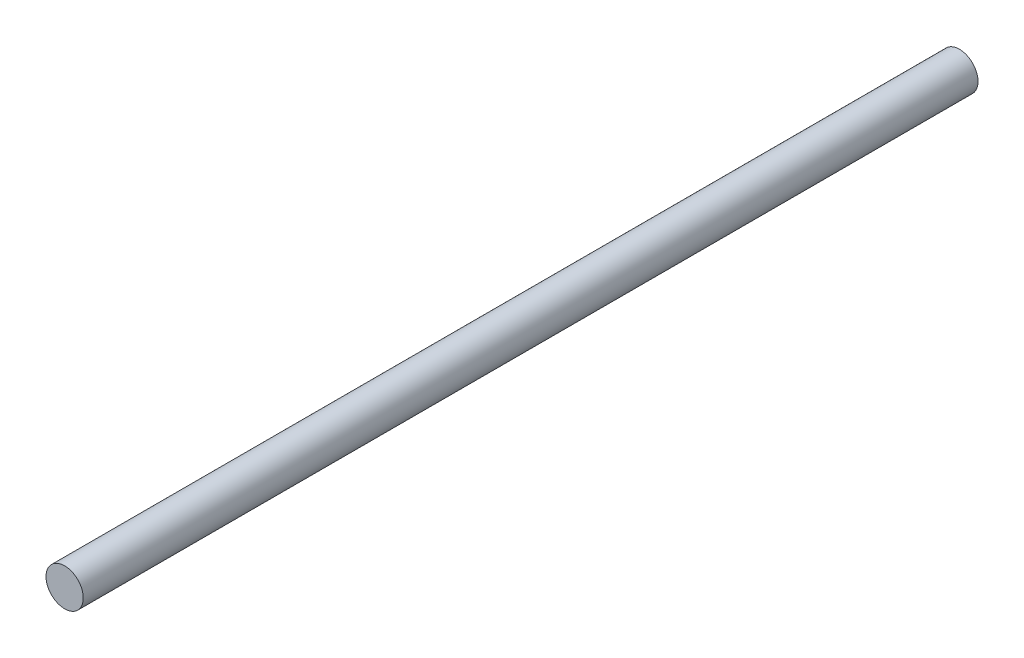
ISO-10303-21;
HEADER;
FILE_DESCRIPTION(('STEP AP214'),'2;1');
FILE_NAME('part.step','',(''),(''),'','','');
FILE_SCHEMA(('AUTOMOTIVE_DESIGN { 1 0 10303 214 1 1 1 1 }'));
ENDSEC;
DATA;
#1=APPLICATION_CONTEXT('core data for automotive mechanical design processes');
#2=APPLICATION_PROTOCOL_DEFINITION('international standard','automotive_design',2000,#1);
#3=PRODUCT_CONTEXT('',#1,'mechanical');
#4=PRODUCT('Part','Part','',(#3));
#5=PRODUCT_RELATED_PRODUCT_CATEGORY('part','',(#4));
#6=PRODUCT_DEFINITION_FORMATION('','',#4);
#7=PRODUCT_DEFINITION_CONTEXT('part definition',#1,'design');
#8=PRODUCT_DEFINITION('design','',#6,#7);
#9=PRODUCT_DEFINITION_SHAPE('','',#8);
#10=(LENGTH_UNIT() NAMED_UNIT(*) SI_UNIT(.MILLI.,.METRE.));
#11=(NAMED_UNIT(*) PLANE_ANGLE_UNIT() SI_UNIT($,.RADIAN.));
#12=(NAMED_UNIT(*) SI_UNIT($,.STERADIAN.) SOLID_ANGLE_UNIT());
#13=UNCERTAINTY_MEASURE_WITH_UNIT(LENGTH_MEASURE(1.E-05),#10,'distance_accuracy_value','');
#14=(GEOMETRIC_REPRESENTATION_CONTEXT(3) GLOBAL_UNCERTAINTY_ASSIGNED_CONTEXT((#13)) GLOBAL_UNIT_ASSIGNED_CONTEXT((#10,
#11,#12)) REPRESENTATION_CONTEXT('',''));
#15=CARTESIAN_POINT('',(0.,0.,0.));
#16=DIRECTION('',(0.,0.,1.));
#17=DIRECTION('',(1.,0.,0.));
#18=AXIS2_PLACEMENT_3D('',#15,#16,#17);
#19=CARTESIAN_POINT('',(0.,0.,152.4));
#20=DIRECTION('',(0.,0.,-1.));
#21=DIRECTION('',(-1.,0.,0.));
#22=AXIS2_PLACEMENT_3D('',#19,#20,#21);
#23=CYLINDRICAL_SURFACE('',#22,3.175);
#24=CARTESIAN_POINT('',(0.,0.,152.4));
#25=DIRECTION('',(0.,0.,1.));
#26=DIRECTION('',(1.,0.,0.));
#27=AXIS2_PLACEMENT_3D('',#24,#25,#26);
#28=CIRCLE('',#27,3.175);
#29=CARTESIAN_POINT('',(-3.175,0.,152.4));
#30=VERTEX_POINT('',#29);
#31=EDGE_CURVE('E10',#30,#30,#28,.T.);
#32=CARTESIAN_POINT('',(0.,0.,0.));
#33=DIRECTION('',(0.,0.,1.));
#34=DIRECTION('',(1.,0.,0.));
#35=AXIS2_PLACEMENT_3D('',#32,#33,#34);
#36=CIRCLE('',#35,3.175);
#37=CARTESIAN_POINT('',(-3.175,0.,0.));
#38=VERTEX_POINT('',#37);
#39=EDGE_CURVE('E40',#38,#38,#36,.T.);
#40=CARTESIAN_POINT('',(-3.175,0.,152.4));
#41=CARTESIAN_POINT('',(-3.175,0.,150.8125));
#42=CARTESIAN_POINT('',(-3.175,0.,149.225));
#43=CARTESIAN_POINT('',(-3.175,0.,146.05));
#44=CARTESIAN_POINT('',(-3.175,0.,144.4625));
#45=CARTESIAN_POINT('',(-3.175,0.,141.2875));
#46=CARTESIAN_POINT('',(-3.175,0.,139.7));
#47=CARTESIAN_POINT('',(-3.175,0.,136.525));
#48=CARTESIAN_POINT('',(-3.175,0.,134.9375));
#49=CARTESIAN_POINT('',(-3.175,0.,131.7625));
#50=CARTESIAN_POINT('',(-3.175,0.,130.175));
#51=CARTESIAN_POINT('',(-3.175,0.,127.));
#52=CARTESIAN_POINT('',(-3.175,0.,125.4125));
#53=CARTESIAN_POINT('',(-3.175,0.,122.2375));
#54=CARTESIAN_POINT('',(-3.175,0.,120.65));
#55=CARTESIAN_POINT('',(-3.175,0.,117.475));
#56=CARTESIAN_POINT('',(-3.175,0.,115.8875));
#57=CARTESIAN_POINT('',(-3.175,0.,112.7125));
#58=CARTESIAN_POINT('',(-3.175,0.,111.125));
#59=CARTESIAN_POINT('',(-3.175,0.,107.95));
#60=CARTESIAN_POINT('',(-3.175,0.,106.3625));
#61=CARTESIAN_POINT('',(-3.175,0.,103.1875));
#62=CARTESIAN_POINT('',(-3.175,0.,101.6));
#63=CARTESIAN_POINT('',(-3.175,0.,98.425));
#64=CARTESIAN_POINT('',(-3.175,0.,96.8375));
#65=CARTESIAN_POINT('',(-3.175,0.,93.6625));
#66=CARTESIAN_POINT('',(-3.175,0.,92.075));
#67=CARTESIAN_POINT('',(-3.175,0.,88.9));
#68=CARTESIAN_POINT('',(-3.175,0.,87.3125));
#69=CARTESIAN_POINT('',(-3.175,0.,84.1375));
#70=CARTESIAN_POINT('',(-3.175,0.,82.55));
#71=CARTESIAN_POINT('',(-3.175,0.,79.375));
#72=CARTESIAN_POINT('',(-3.175,0.,77.7875));
#73=CARTESIAN_POINT('',(-3.175,0.,74.6125));
#74=CARTESIAN_POINT('',(-3.175,0.,73.025));
#75=CARTESIAN_POINT('',(-3.175,0.,69.85));
#76=CARTESIAN_POINT('',(-3.175,0.,68.2625));
#77=CARTESIAN_POINT('',(-3.175,0.,65.0875));
#78=CARTESIAN_POINT('',(-3.175,0.,63.5));
#79=CARTESIAN_POINT('',(-3.175,0.,60.325));
#80=CARTESIAN_POINT('',(-3.175,0.,58.7375));
#81=CARTESIAN_POINT('',(-3.175,0.,55.5625));
#82=CARTESIAN_POINT('',(-3.175,0.,53.975));
#83=CARTESIAN_POINT('',(-3.175,0.,50.8));
#84=CARTESIAN_POINT('',(-3.175,0.,49.2125));
#85=CARTESIAN_POINT('',(-3.175,0.,46.0375));
#86=CARTESIAN_POINT('',(-3.175,0.,44.45));
#87=CARTESIAN_POINT('',(-3.175,0.,41.275));
#88=CARTESIAN_POINT('',(-3.175,0.,39.6875));
#89=CARTESIAN_POINT('',(-3.175,0.,36.5125));
#90=CARTESIAN_POINT('',(-3.175,0.,34.925));
#91=CARTESIAN_POINT('',(-3.175,0.,31.75));
#92=CARTESIAN_POINT('',(-3.175,0.,30.1625));
#93=CARTESIAN_POINT('',(-3.175,0.,26.9875));
#94=CARTESIAN_POINT('',(-3.175,0.,25.4));
#95=CARTESIAN_POINT('',(-3.175,0.,22.225));
#96=CARTESIAN_POINT('',(-3.175,0.,20.6375));
#97=CARTESIAN_POINT('',(-3.175,0.,17.4625));
#98=CARTESIAN_POINT('',(-3.175,0.,15.875));
#99=CARTESIAN_POINT('',(-3.175,0.,12.7));
#100=CARTESIAN_POINT('',(-3.175,0.,11.1125));
#101=CARTESIAN_POINT('',(-3.175,0.,7.93750000000001));
#102=CARTESIAN_POINT('',(-3.175,0.,6.35));
#103=CARTESIAN_POINT('',(-3.175,0.,3.175));
#104=CARTESIAN_POINT('',(-3.175,0.,1.5875));
#105=CARTESIAN_POINT('',(-3.175,0.,0.));
#106=B_SPLINE_CURVE_WITH_KNOTS('',3,(#40,#41,#42,#43,#44,#45,#46,#47,#48,#49,#50,#51,#52,#53,
#54,#55,#56,#57,#58,#59,#60,#61,#62,#63,#64,#65,#66,#67,#68,#69,#70,#71,#72,#73,#74,#75,#76,#77,
#78,#79,#80,#81,#82,#83,#84,#85,#86,#87,#88,#89,#90,#91,#92,#93,#94,#95,#96,#97,#98,#99,#100,
#101,#102,#103,#104,#105),.UNSPECIFIED.,.F.,.F.,(4,2,2,2,2,2,2,2,2,2,2,2,2,2,2,2,2,2,2,2,2,2,2,
2,2,2,2,2,2,2,2,2,4),(0.,4.7625,9.52500000000001,14.2875,19.05,23.8125,28.575,33.3375,38.1,
42.8625,47.625,52.3875,57.15,61.9125,66.675,71.4375,76.2,80.9625,85.725,90.4875,95.25,100.0125,
104.775,109.5375,114.3,119.0625,123.825,128.5875,133.35,138.1125,142.875,147.6375,152.4),.UNSPECIFIED.);
#107=EDGE_CURVE('BSEAM37',#30,#38,#106,.T.);
#108=ORIENTED_EDGE('',*,*,#31,.F.);
#109=ORIENTED_EDGE('',*,*,#39,.T.);
#110=ORIENTED_EDGE('',*,*,#107,.T.);
#111=ORIENTED_EDGE('',*,*,#107,.F.);
#112=EDGE_LOOP('',(#108,#110,#109,#111));
#113=FACE_BOUND('',#112,.T.);
#114=ADVANCED_FACE('F37',(#113),#23,.T.);
#115=CARTESIAN_POINT('',(0.,0.,152.4));
#116=DIRECTION('',(0.,0.,1.));
#117=DIRECTION('',(1.,0.,0.));
#118=AXIS2_PLACEMENT_3D('',#115,#116,#117);
#119=PLANE('',#118);
#120=ORIENTED_EDGE('',*,*,#31,.T.);
#121=EDGE_LOOP('',(#120));
#122=FACE_BOUND('',#121,.T.);
#123=ADVANCED_FACE('F54',(#122),#119,.T.);
#124=CARTESIAN_POINT('',(0.,0.,0.));
#125=DIRECTION('',(0.,0.,1.));
#126=DIRECTION('',(1.,0.,0.));
#127=AXIS2_PLACEMENT_3D('',#124,#125,#126);
#128=PLANE('',#127);
#129=ORIENTED_EDGE('',*,*,#39,.F.);
#130=EDGE_LOOP('',(#129));
#131=FACE_BOUND('',#130,.T.);
#132=ADVANCED_FACE('F52',(#131),#128,.F.);
#133=CLOSED_SHELL('',(#114,#123,#132));
#134=MANIFOLD_SOLID_BREP('B2',#133);
#135=ADVANCED_BREP_SHAPE_REPRESENTATION('',(#18,#134),#14);
#136=SHAPE_DEFINITION_REPRESENTATION(#9,#135);
ENDSEC;
END-ISO-10303-21;
